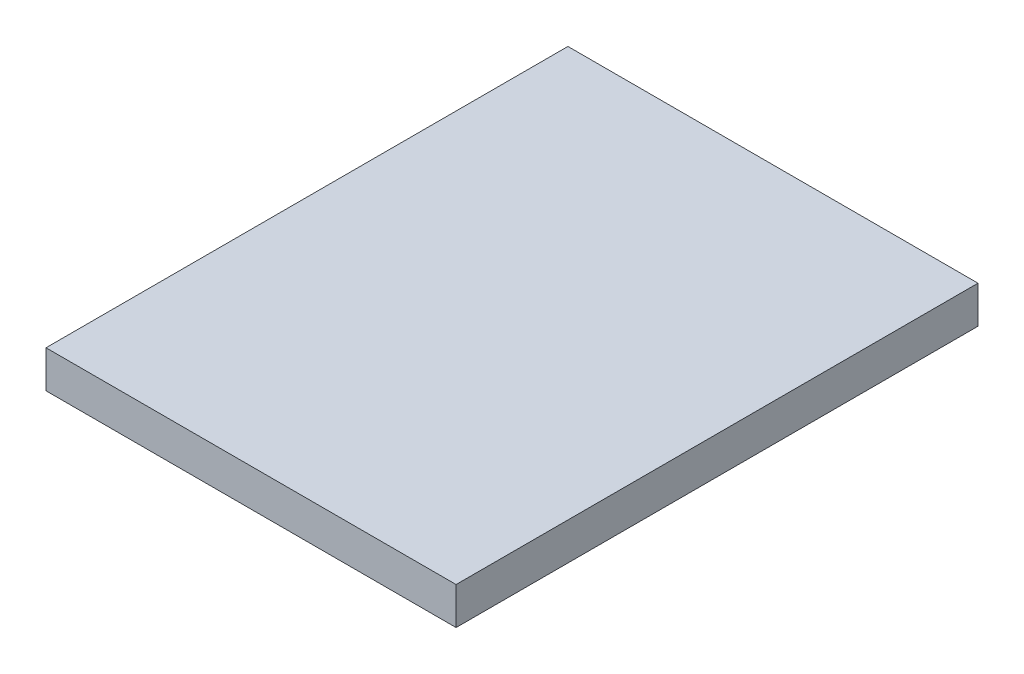
ISO-10303-21;
HEADER;
FILE_DESCRIPTION(('STEP AP214'),'2;1');
FILE_NAME('part.step','',(''),(''),'','','');
FILE_SCHEMA(('AUTOMOTIVE_DESIGN { 1 0 10303 214 1 1 1 1 }'));
ENDSEC;
DATA;
#1=APPLICATION_CONTEXT('core data for automotive mechanical design processes');
#2=APPLICATION_PROTOCOL_DEFINITION('international standard','automotive_design',2000,#1);
#3=PRODUCT_CONTEXT('',#1,'mechanical');
#4=PRODUCT('Part','Part','',(#3));
#5=PRODUCT_RELATED_PRODUCT_CATEGORY('part','',(#4));
#6=PRODUCT_DEFINITION_FORMATION('','',#4);
#7=PRODUCT_DEFINITION_CONTEXT('part definition',#1,'design');
#8=PRODUCT_DEFINITION('design','',#6,#7);
#9=PRODUCT_DEFINITION_SHAPE('','',#8);
#10=(LENGTH_UNIT() NAMED_UNIT(*) SI_UNIT(.MILLI.,.METRE.));
#11=(NAMED_UNIT(*) PLANE_ANGLE_UNIT() SI_UNIT($,.RADIAN.));
#12=(NAMED_UNIT(*) SI_UNIT($,.STERADIAN.) SOLID_ANGLE_UNIT());
#13=UNCERTAINTY_MEASURE_WITH_UNIT(LENGTH_MEASURE(1.E-05),#10,'distance_accuracy_value','');
#14=(GEOMETRIC_REPRESENTATION_CONTEXT(3) GLOBAL_UNCERTAINTY_ASSIGNED_CONTEXT((#13)) GLOBAL_UNIT_ASSIGNED_CONTEXT((#10,
#11,#12)) REPRESENTATION_CONTEXT('',''));
#15=CARTESIAN_POINT('',(0.,0.,0.));
#16=DIRECTION('',(0.,0.,1.));
#17=DIRECTION('',(1.,0.,0.));
#18=AXIS2_PLACEMENT_3D('',#15,#16,#17);
#19=CARTESIAN_POINT('',(55.,10.,70.));
#20=DIRECTION('',(-1.,0.,0.));
#21=DIRECTION('',(0.,0.,1.));
#22=AXIS2_PLACEMENT_3D('',#19,#20,#21);
#23=PLANE('',#22);
#24=DIRECTION('',(0.,0.,-1.));
#25=VECTOR('',#24,1.);
#26=CARTESIAN_POINT('',(55.,0.,70.));
#27=LINE('',#26,#25);
#28=CARTESIAN_POINT('',(55.,0.,70.));
#29=VERTEX_POINT('',#28);
#30=CARTESIAN_POINT('',(55.,0.,-70.));
#31=VERTEX_POINT('',#30);
#32=EDGE_CURVE('E101',#29,#31,#27,.T.);
#33=ORIENTED_EDGE('',*,*,#32,.T.);
#34=DIRECTION('',(0.,-1.,0.));
#35=VECTOR('',#34,1.);
#36=CARTESIAN_POINT('',(55.,10.,-70.));
#37=LINE('',#36,#35);
#38=CARTESIAN_POINT('',(55.,10.,-70.));
#39=VERTEX_POINT('',#38);
#40=EDGE_CURVE('E11',#39,#31,#37,.T.);
#41=ORIENTED_EDGE('',*,*,#40,.F.);
#42=DIRECTION('',(0.,0.,-1.));
#43=VECTOR('',#42,1.);
#44=CARTESIAN_POINT('',(55.,10.,70.));
#45=LINE('',#44,#43);
#46=CARTESIAN_POINT('',(55.,10.,70.));
#47=VERTEX_POINT('',#46);
#48=EDGE_CURVE('E89',#47,#39,#45,.T.);
#49=ORIENTED_EDGE('',*,*,#48,.F.);
#50=DIRECTION('',(0.,-1.,0.));
#51=VECTOR('',#50,1.);
#52=CARTESIAN_POINT('',(55.,10.,70.));
#53=LINE('',#52,#51);
#54=EDGE_CURVE('E97',#47,#29,#53,.T.);
#55=ORIENTED_EDGE('',*,*,#54,.T.);
#56=EDGE_LOOP('',(#33,#41,#49,#55));
#57=FACE_BOUND('',#56,.T.);
#58=ADVANCED_FACE('F38',(#57),#23,.F.);
#59=CARTESIAN_POINT('',(-55.,10.,-70.));
#60=DIRECTION('',(0.,0.,1.));
#61=DIRECTION('',(1.,0.,0.));
#62=AXIS2_PLACEMENT_3D('',#59,#60,#61);
#63=PLANE('',#62);
#64=DIRECTION('',(-1.,0.,0.));
#65=VECTOR('',#64,1.);
#66=CARTESIAN_POINT('',(-55.,0.,-70.));
#67=LINE('',#66,#65);
#68=CARTESIAN_POINT('',(-55.,0.,-70.));
#69=VERTEX_POINT('',#68);
#70=EDGE_CURVE('E93',#31,#69,#67,.T.);
#71=ORIENTED_EDGE('',*,*,#70,.T.);
#72=DIRECTION('',(0.,-1.,0.));
#73=VECTOR('',#72,1.);
#74=CARTESIAN_POINT('',(-55.,10.,-70.));
#75=LINE('',#74,#73);
#76=CARTESIAN_POINT('',(-55.,10.,-70.));
#77=VERTEX_POINT('',#76);
#78=EDGE_CURVE('E46',#77,#69,#75,.T.);
#79=ORIENTED_EDGE('',*,*,#78,.F.);
#80=DIRECTION('',(-1.,0.,0.));
#81=VECTOR('',#80,1.);
#82=CARTESIAN_POINT('',(-55.,10.,-70.));
#83=LINE('',#82,#81);
#84=EDGE_CURVE('E84',#39,#77,#83,.T.);
#85=ORIENTED_EDGE('',*,*,#84,.F.);
#86=ORIENTED_EDGE('',*,*,#40,.T.);
#87=EDGE_LOOP('',(#71,#79,#85,#86));
#88=FACE_BOUND('',#87,.T.);
#89=ADVANCED_FACE('F92',(#88),#63,.F.);
#90=CARTESIAN_POINT('',(-55.,10.,70.));
#91=DIRECTION('',(1.,0.,0.));
#92=DIRECTION('',(0.,0.,-1.));
#93=AXIS2_PLACEMENT_3D('',#90,#91,#92);
#94=PLANE('',#93);
#95=DIRECTION('',(0.,0.,1.));
#96=VECTOR('',#95,1.);
#97=CARTESIAN_POINT('',(-55.,0.,70.));
#98=LINE('',#97,#96);
#99=CARTESIAN_POINT('',(-55.,0.,70.));
#100=VERTEX_POINT('',#99);
#101=EDGE_CURVE('E71',#69,#100,#98,.T.);
#102=ORIENTED_EDGE('',*,*,#101,.T.);
#103=DIRECTION('',(0.,-1.,0.));
#104=VECTOR('',#103,1.);
#105=CARTESIAN_POINT('',(-55.,10.,70.));
#106=LINE('',#105,#104);
#107=CARTESIAN_POINT('',(-55.,10.,70.));
#108=VERTEX_POINT('',#107);
#109=EDGE_CURVE('E94',#108,#100,#106,.T.);
#110=ORIENTED_EDGE('',*,*,#109,.F.);
#111=DIRECTION('',(0.,0.,1.));
#112=VECTOR('',#111,1.);
#113=CARTESIAN_POINT('',(-55.,10.,70.));
#114=LINE('',#113,#112);
#115=EDGE_CURVE('E87',#77,#108,#114,.T.);
#116=ORIENTED_EDGE('',*,*,#115,.F.);
#117=ORIENTED_EDGE('',*,*,#78,.T.);
#118=EDGE_LOOP('',(#102,#110,#116,#117));
#119=FACE_BOUND('',#118,.T.);
#120=ADVANCED_FACE('F95',(#119),#94,.F.);
#121=CARTESIAN_POINT('',(-55.,10.,70.));
#122=DIRECTION('',(0.,0.,-1.));
#123=DIRECTION('',(-1.,0.,0.));
#124=AXIS2_PLACEMENT_3D('',#121,#122,#123);
#125=PLANE('',#124);
#126=DIRECTION('',(1.,0.,0.));
#127=VECTOR('',#126,1.);
#128=CARTESIAN_POINT('',(-55.,0.,70.));
#129=LINE('',#128,#127);
#130=EDGE_CURVE('E77',#100,#29,#129,.T.);
#131=ORIENTED_EDGE('',*,*,#130,.T.);
#132=ORIENTED_EDGE('',*,*,#54,.F.);
#133=DIRECTION('',(1.,0.,0.));
#134=VECTOR('',#133,1.);
#135=CARTESIAN_POINT('',(-55.,10.,70.));
#136=LINE('',#135,#134);
#137=EDGE_CURVE('E54',#108,#47,#136,.T.);
#138=ORIENTED_EDGE('',*,*,#137,.F.);
#139=ORIENTED_EDGE('',*,*,#109,.T.);
#140=EDGE_LOOP('',(#131,#132,#138,#139));
#141=FACE_BOUND('',#140,.T.);
#142=ADVANCED_FACE('F108',(#141),#125,.F.);
#143=CARTESIAN_POINT('',(0.,10.,0.));
#144=DIRECTION('',(0.,-1.,0.));
#145=DIRECTION('',(0.,0.,-1.));
#146=AXIS2_PLACEMENT_3D('',#143,#144,#145);
#147=PLANE('',#146);
#148=ORIENTED_EDGE('',*,*,#48,.T.);
#149=ORIENTED_EDGE('',*,*,#84,.T.);
#150=ORIENTED_EDGE('',*,*,#115,.T.);
#151=ORIENTED_EDGE('',*,*,#137,.T.);
#152=EDGE_LOOP('',(#148,#149,#150,#151));
#153=FACE_BOUND('',#152,.T.);
#154=ADVANCED_FACE('F85',(#153),#147,.F.);
#155=CARTESIAN_POINT('',(0.,0.,0.));
#156=DIRECTION('',(0.,-1.,0.));
#157=DIRECTION('',(0.,0.,-1.));
#158=AXIS2_PLACEMENT_3D('',#155,#156,#157);
#159=PLANE('',#158);
#160=ORIENTED_EDGE('',*,*,#32,.F.);
#161=ORIENTED_EDGE('',*,*,#130,.F.);
#162=ORIENTED_EDGE('',*,*,#101,.F.);
#163=ORIENTED_EDGE('',*,*,#70,.F.);
#164=EDGE_LOOP('',(#160,#161,#162,#163));
#165=FACE_BOUND('',#164,.T.);
#166=ADVANCED_FACE('F111',(#165),#159,.T.);
#167=CLOSED_SHELL('',(#58,#89,#120,#142,#154,#166));
#168=MANIFOLD_SOLID_BREP('B2',#167);
#169=ADVANCED_BREP_SHAPE_REPRESENTATION('',(#18,#168),#14);
#170=SHAPE_DEFINITION_REPRESENTATION(#9,#169);
ENDSEC;
END-ISO-10303-21;
